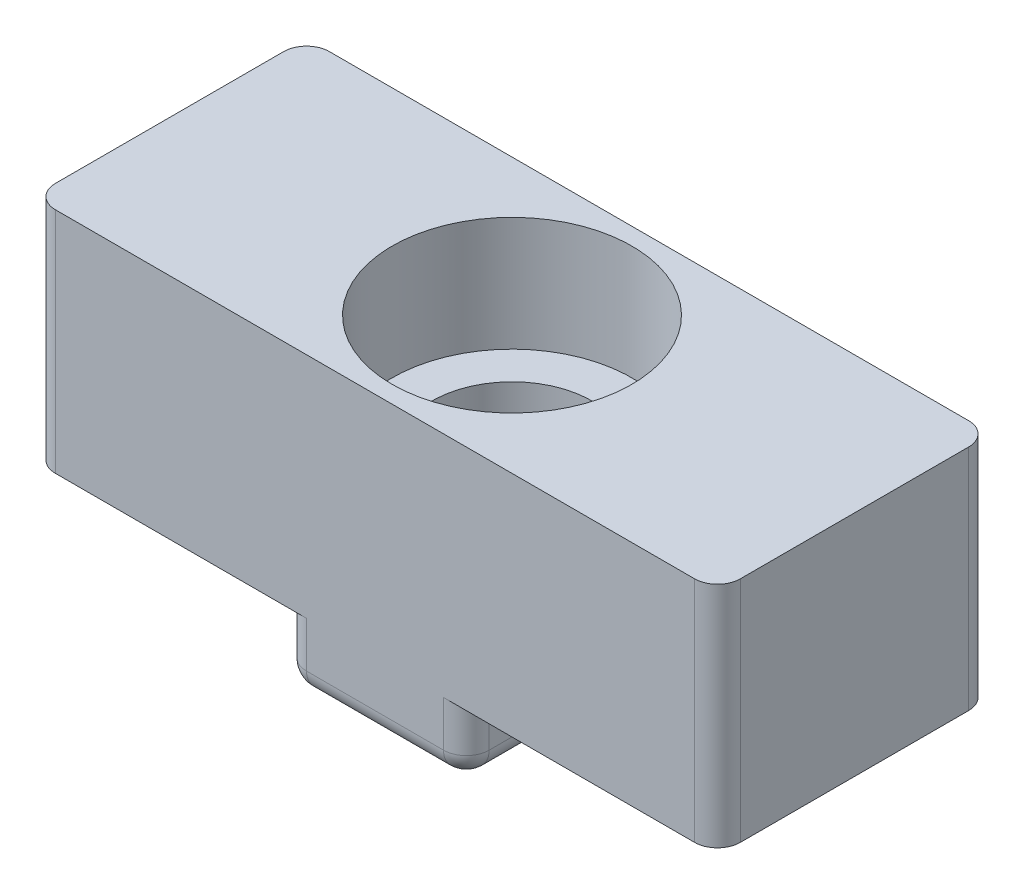
ISO-10303-21;
HEADER;
FILE_DESCRIPTION(('STEP AP214'),'2;1');
FILE_NAME('part.step','',(''),(''),'','','');
FILE_SCHEMA(('AUTOMOTIVE_DESIGN { 1 0 10303 214 1 1 1 1 }'));
ENDSEC;
DATA;
#1=APPLICATION_CONTEXT('core data for automotive mechanical design processes');
#2=APPLICATION_PROTOCOL_DEFINITION('international standard','automotive_design',2000,#1);
#3=PRODUCT_CONTEXT('',#1,'mechanical');
#4=PRODUCT('Part','Part','',(#3));
#5=PRODUCT_RELATED_PRODUCT_CATEGORY('part','',(#4));
#6=PRODUCT_DEFINITION_FORMATION('','',#4);
#7=PRODUCT_DEFINITION_CONTEXT('part definition',#1,'design');
#8=PRODUCT_DEFINITION('design','',#6,#7);
#9=PRODUCT_DEFINITION_SHAPE('','',#8);
#10=(LENGTH_UNIT() NAMED_UNIT(*) SI_UNIT(.MILLI.,.METRE.));
#11=(NAMED_UNIT(*) PLANE_ANGLE_UNIT() SI_UNIT($,.RADIAN.));
#12=(NAMED_UNIT(*) SI_UNIT($,.STERADIAN.) SOLID_ANGLE_UNIT());
#13=UNCERTAINTY_MEASURE_WITH_UNIT(LENGTH_MEASURE(1.E-05),#10,'distance_accuracy_value','');
#14=(GEOMETRIC_REPRESENTATION_CONTEXT(3) GLOBAL_UNCERTAINTY_ASSIGNED_CONTEXT((#13)) GLOBAL_UNIT_ASSIGNED_CONTEXT((#10,
#11,#12)) REPRESENTATION_CONTEXT('',''));
#15=CARTESIAN_POINT('',(0.,0.,0.));
#16=DIRECTION('',(0.,0.,1.));
#17=DIRECTION('',(1.,0.,0.));
#18=AXIS2_PLACEMENT_3D('',#15,#16,#17);
#19=CARTESIAN_POINT('',(-4.,0.,6.));
#20=DIRECTION('',(0.,1.,0.));
#21=DIRECTION('',(0.,0.,1.));
#22=AXIS2_PLACEMENT_3D('',#19,#20,#21);
#23=PLANE('',#22);
#24=CARTESIAN_POINT('',(0.,0.,0.));
#25=DIRECTION('',(0.,1.,0.));
#26=DIRECTION('',(0.,0.,1.));
#27=AXIS2_PLACEMENT_3D('',#24,#25,#26);
#28=CIRCLE('',#27,3.5);
#29=CARTESIAN_POINT('',(-3.,0.,1.80277563773199));
#30=VERTEX_POINT('',#29);
#31=CARTESIAN_POINT('',(3.,0.,1.80277563773199));
#32=VERTEX_POINT('',#31);
#33=EDGE_CURVE('E179',#30,#32,#28,.T.);
#34=ORIENTED_EDGE('',*,*,#33,.T.);
#35=DIRECTION('',(0.,0.,-1.));
#36=VECTOR('',#35,1.);
#37=CARTESIAN_POINT('',(3.,0.,6.));
#38=LINE('',#37,#36);
#39=CARTESIAN_POINT('',(3.,0.,5.));
#40=VERTEX_POINT('',#39);
#41=EDGE_CURVE('E190',#32,#40,#38,.F.);
#42=ORIENTED_EDGE('',*,*,#41,.T.);
#43=DIRECTION('',(1.,0.,0.));
#44=VECTOR('',#43,1.);
#45=CARTESIAN_POINT('',(-4.,0.,5.));
#46=LINE('',#45,#44);
#47=CARTESIAN_POINT('',(-3.,0.,5.));
#48=VERTEX_POINT('',#47);
#49=EDGE_CURVE('E202',#40,#48,#46,.F.);
#50=ORIENTED_EDGE('',*,*,#49,.T.);
#51=DIRECTION('',(0.,0.,-1.));
#52=VECTOR('',#51,1.);
#53=CARTESIAN_POINT('',(-3.,0.,6.));
#54=LINE('',#53,#52);
#55=EDGE_CURVE('E193',#48,#30,#54,.T.);
#56=ORIENTED_EDGE('',*,*,#55,.T.);
#57=EDGE_LOOP('',(#34,#42,#50,#56));
#58=FACE_BOUND('',#57,.T.);
#59=ADVANCED_FACE('F33',(#58),#23,.F.);
#60=CARTESIAN_POINT('',(15.,13.,6.));
#61=DIRECTION('',(0.,-1.,0.));
#62=DIRECTION('',(0.,0.,-1.));
#63=AXIS2_PLACEMENT_3D('',#60,#61,#62);
#64=PLANE('',#63);
#65=CARTESIAN_POINT('',(0.,13.,0.));
#66=DIRECTION('',(0.,1.,0.));
#67=DIRECTION('',(0.,0.,1.));
#68=AXIS2_PLACEMENT_3D('',#65,#66,#67);
#69=CIRCLE('',#68,5.25);
#70=CARTESIAN_POINT('',(0.,13.,5.25));
#71=VERTEX_POINT('',#70);
#72=EDGE_CURVE('E561',#71,#71,#69,.T.);
#73=ORIENTED_EDGE('',*,*,#72,.F.);
#74=EDGE_LOOP('',(#73));
#75=FACE_BOUND('',#74,.T.);
#76=DIRECTION('',(0.,0.,-1.));
#77=VECTOR('',#76,1.);
#78=CARTESIAN_POINT('',(15.,13.,6.));
#79=LINE('',#78,#77);
#80=CARTESIAN_POINT('',(15.,13.,5.));
#81=VERTEX_POINT('',#80);
#82=CARTESIAN_POINT('',(15.,13.,-5.));
#83=VERTEX_POINT('',#82);
#84=EDGE_CURVE('E582',#81,#83,#79,.T.);
#85=ORIENTED_EDGE('',*,*,#84,.T.);
#86=CARTESIAN_POINT('',(14.,13.,-5.));
#87=DIRECTION('',(0.,-1.,0.));
#88=DIRECTION('',(0.,0.,-1.));
#89=AXIS2_PLACEMENT_3D('',#86,#87,#88);
#90=CIRCLE('',#89,1.);
#91=CARTESIAN_POINT('',(14.,13.,-6.));
#92=VERTEX_POINT('',#91);
#93=EDGE_CURVE('E514',#83,#92,#90,.F.);
#94=ORIENTED_EDGE('',*,*,#93,.T.);
#95=DIRECTION('',(-1.,0.,0.));
#96=VECTOR('',#95,1.);
#97=CARTESIAN_POINT('',(15.,13.,-6.));
#98=LINE('',#97,#96);
#99=CARTESIAN_POINT('',(-14.,13.,-6.));
#100=VERTEX_POINT('',#99);
#101=EDGE_CURVE('E583',#92,#100,#98,.T.);
#102=ORIENTED_EDGE('',*,*,#101,.T.);
#103=CARTESIAN_POINT('',(-14.,13.,-5.));
#104=DIRECTION('',(0.,-1.,0.));
#105=DIRECTION('',(0.,0.,-1.));
#106=AXIS2_PLACEMENT_3D('',#103,#104,#105);
#107=CIRCLE('',#106,1.);
#108=CARTESIAN_POINT('',(-15.,13.,-5.));
#109=VERTEX_POINT('',#108);
#110=EDGE_CURVE('E497',#100,#109,#107,.F.);
#111=ORIENTED_EDGE('',*,*,#110,.T.);
#112=DIRECTION('',(0.,0.,-1.));
#113=VECTOR('',#112,1.);
#114=CARTESIAN_POINT('',(-15.,13.,6.));
#115=LINE('',#114,#113);
#116=CARTESIAN_POINT('',(-15.,13.,5.));
#117=VERTEX_POINT('',#116);
#118=EDGE_CURVE('E602',#117,#109,#115,.T.);
#119=ORIENTED_EDGE('',*,*,#118,.F.);
#120=CARTESIAN_POINT('',(-14.,13.,5.));
#121=DIRECTION('',(0.,-1.,0.));
#122=DIRECTION('',(0.,0.,-1.));
#123=AXIS2_PLACEMENT_3D('',#120,#121,#122);
#124=CIRCLE('',#123,1.);
#125=CARTESIAN_POINT('',(-14.,13.,6.));
#126=VERTEX_POINT('',#125);
#127=EDGE_CURVE('E503',#117,#126,#124,.F.);
#128=ORIENTED_EDGE('',*,*,#127,.T.);
#129=DIRECTION('',(-1.,0.,0.));
#130=VECTOR('',#129,1.);
#131=CARTESIAN_POINT('',(15.,13.,6.));
#132=LINE('',#131,#130);
#133=CARTESIAN_POINT('',(14.,13.,6.));
#134=VERTEX_POINT('',#133);
#135=EDGE_CURVE('E573',#134,#126,#132,.T.);
#136=ORIENTED_EDGE('',*,*,#135,.F.);
#137=CARTESIAN_POINT('',(14.,13.,5.));
#138=DIRECTION('',(0.,-1.,0.));
#139=DIRECTION('',(0.,0.,-1.));
#140=AXIS2_PLACEMENT_3D('',#137,#138,#139);
#141=CIRCLE('',#140,1.);
#142=EDGE_CURVE('E506',#134,#81,#141,.F.);
#143=ORIENTED_EDGE('',*,*,#142,.T.);
#144=EDGE_LOOP('',(#85,#94,#102,#111,#119,#128,#136,#143));
#145=FACE_BOUND('',#144,.T.);
#146=ADVANCED_FACE('F291',(#75,#145),#64,.F.);
#147=CARTESIAN_POINT('',(-15.,13.,6.));
#148=DIRECTION('',(1.,0.,0.));
#149=DIRECTION('',(0.,0.,-1.));
#150=AXIS2_PLACEMENT_3D('',#147,#148,#149);
#151=PLANE('',#150);
#152=DIRECTION('',(0.,0.,-1.));
#153=VECTOR('',#152,1.);
#154=CARTESIAN_POINT('',(-15.,3.,6.));
#155=LINE('',#154,#153);
#156=CARTESIAN_POINT('',(-15.,3.,5.));
#157=VERTEX_POINT('',#156);
#158=CARTESIAN_POINT('',(-15.,3.,-5.));
#159=VERTEX_POINT('',#158);
#160=EDGE_CURVE('E600',#157,#159,#155,.T.);
#161=ORIENTED_EDGE('',*,*,#160,.F.);
#162=DIRECTION('',(0.,-1.,0.));
#163=VECTOR('',#162,1.);
#164=CARTESIAN_POINT('',(-15.,13.,5.));
#165=LINE('',#164,#163);
#166=EDGE_CURVE('E523',#157,#117,#165,.F.);
#167=ORIENTED_EDGE('',*,*,#166,.T.);
#168=ORIENTED_EDGE('',*,*,#118,.T.);
#169=DIRECTION('',(0.,-1.,0.));
#170=VECTOR('',#169,1.);
#171=CARTESIAN_POINT('',(-15.,13.,-5.));
#172=LINE('',#171,#170);
#173=EDGE_CURVE('E498',#109,#159,#172,.T.);
#174=ORIENTED_EDGE('',*,*,#173,.T.);
#175=EDGE_LOOP('',(#161,#167,#168,#174));
#176=FACE_BOUND('',#175,.T.);
#177=ADVANCED_FACE('F288',(#176),#151,.F.);
#178=CARTESIAN_POINT('',(-15.,3.,6.));
#179=DIRECTION('',(0.,1.,0.));
#180=DIRECTION('',(-1.,0.,0.));
#181=AXIS2_PLACEMENT_3D('',#178,#179,#180);
#182=PLANE('',#181);
#183=DIRECTION('',(1.,0.,0.));
#184=VECTOR('',#183,1.);
#185=CARTESIAN_POINT('',(-15.,3.,6.));
#186=LINE('',#185,#184);
#187=CARTESIAN_POINT('',(-14.,3.,6.));
#188=VERTEX_POINT('',#187);
#189=CARTESIAN_POINT('',(-3.,3.,6.));
#190=VERTEX_POINT('',#189);
#191=EDGE_CURVE('E576',#188,#190,#186,.T.);
#192=ORIENTED_EDGE('',*,*,#191,.F.);
#193=CARTESIAN_POINT('',(-14.,3.,5.));
#194=DIRECTION('',(0.,1.,0.));
#195=DIRECTION('',(-1.,0.,0.));
#196=AXIS2_PLACEMENT_3D('',#193,#194,#195);
#197=CIRCLE('',#196,1.);
#198=EDGE_CURVE('E58',#188,#157,#197,.F.);
#199=ORIENTED_EDGE('',*,*,#198,.T.);
#200=ORIENTED_EDGE('',*,*,#160,.T.);
#201=CARTESIAN_POINT('',(-14.,3.,-5.));
#202=DIRECTION('',(0.,1.,0.));
#203=DIRECTION('',(-1.,0.,0.));
#204=AXIS2_PLACEMENT_3D('',#201,#202,#203);
#205=CIRCLE('',#204,1.);
#206=CARTESIAN_POINT('',(-14.,3.,-6.));
#207=VERTEX_POINT('',#206);
#208=EDGE_CURVE('E50',#159,#207,#205,.F.);
#209=ORIENTED_EDGE('',*,*,#208,.T.);
#210=DIRECTION('',(1.,0.,0.));
#211=VECTOR('',#210,1.);
#212=CARTESIAN_POINT('',(-15.,3.,-6.));
#213=LINE('',#212,#211);
#214=CARTESIAN_POINT('',(-3.,3.,-6.));
#215=VERTEX_POINT('',#214);
#216=EDGE_CURVE('E585',#207,#215,#213,.T.);
#217=ORIENTED_EDGE('',*,*,#216,.T.);
#218=CARTESIAN_POINT('',(-3.,3.,-5.));
#219=DIRECTION('',(0.,1.,0.));
#220=DIRECTION('',(-1.,0.,0.));
#221=AXIS2_PLACEMENT_3D('',#218,#219,#220);
#222=CIRCLE('',#221,1.);
#223=CARTESIAN_POINT('',(-4.,3.,-5.));
#224=VERTEX_POINT('',#223);
#225=EDGE_CURVE('E525',#215,#224,#222,.T.);
#226=ORIENTED_EDGE('',*,*,#225,.T.);
#227=DIRECTION('',(0.,0.,-1.));
#228=VECTOR('',#227,1.);
#229=CARTESIAN_POINT('',(-4.,3.,6.));
#230=LINE('',#229,#228);
#231=CARTESIAN_POINT('',(-4.,3.,5.));
#232=VERTEX_POINT('',#231);
#233=EDGE_CURVE('E597',#232,#224,#230,.T.);
#234=ORIENTED_EDGE('',*,*,#233,.F.);
#235=CARTESIAN_POINT('',(-3.,3.,5.));
#236=DIRECTION('',(0.,1.,0.));
#237=DIRECTION('',(-1.,0.,0.));
#238=AXIS2_PLACEMENT_3D('',#235,#236,#237);
#239=CIRCLE('',#238,1.);
#240=EDGE_CURVE('E11',#232,#190,#239,.T.);
#241=ORIENTED_EDGE('',*,*,#240,.T.);
#242=EDGE_LOOP('',(#192,#199,#200,#209,#217,#226,#234,#241));
#243=FACE_BOUND('',#242,.T.);
#244=ADVANCED_FACE('F284',(#243),#182,.F.);
#245=CARTESIAN_POINT('',(-4.,3.,6.));
#246=DIRECTION('',(1.,0.,0.));
#247=DIRECTION('',(0.,0.,-1.));
#248=AXIS2_PLACEMENT_3D('',#245,#246,#247);
#249=PLANE('',#248);
#250=ORIENTED_EDGE('',*,*,#233,.T.);
#251=DIRECTION('',(0.,-1.,0.));
#252=VECTOR('',#251,1.);
#253=CARTESIAN_POINT('',(-4.,3.,-5.));
#254=LINE('',#253,#252);
#255=CARTESIAN_POINT('',(-4.,1.,-5.));
#256=VERTEX_POINT('',#255);
#257=EDGE_CURVE('E638',#224,#256,#254,.T.);
#258=ORIENTED_EDGE('',*,*,#257,.T.);
#259=DIRECTION('',(0.,0.,-1.));
#260=VECTOR('',#259,1.);
#261=CARTESIAN_POINT('',(-4.,1.,6.));
#262=LINE('',#261,#260);
#263=CARTESIAN_POINT('',(-4.,1.,5.));
#264=VERTEX_POINT('',#263);
#265=EDGE_CURVE('E635',#256,#264,#262,.F.);
#266=ORIENTED_EDGE('',*,*,#265,.T.);
#267=DIRECTION('',(0.,-1.,0.));
#268=VECTOR('',#267,1.);
#269=CARTESIAN_POINT('',(-4.,3.,5.));
#270=LINE('',#269,#268);
#271=EDGE_CURVE('E186',#264,#232,#270,.F.);
#272=ORIENTED_EDGE('',*,*,#271,.T.);
#273=EDGE_LOOP('',(#250,#258,#266,#272));
#274=FACE_BOUND('',#273,.T.);
#275=ADVANCED_FACE('F280',(#274),#249,.F.);
#276=DIRECTION('',(1.,0.,0.));
#277=VECTOR('',#276,1.);
#278=CARTESIAN_POINT('',(-4.,0.,-5.));
#279=LINE('',#278,#277);
#280=CARTESIAN_POINT('',(-3.,0.,-5.));
#281=VERTEX_POINT('',#280);
#282=CARTESIAN_POINT('',(3.,0.,-5.));
#283=VERTEX_POINT('',#282);
#284=EDGE_CURVE('E606',#281,#283,#279,.T.);
#285=ORIENTED_EDGE('',*,*,#284,.T.);
#286=DIRECTION('',(0.,0.,-1.));
#287=VECTOR('',#286,1.);
#288=CARTESIAN_POINT('',(3.,0.,6.));
#289=LINE('',#288,#287);
#290=CARTESIAN_POINT('',(3.,0.,-1.80277563773199));
#291=VERTEX_POINT('',#290);
#292=EDGE_CURVE('E609',#283,#291,#289,.F.);
#293=ORIENTED_EDGE('',*,*,#292,.T.);
#294=CARTESIAN_POINT('',(-3.,0.,-1.80277563773199));
#295=VERTEX_POINT('',#294);
#296=EDGE_CURVE('E182',#291,#295,#28,.T.);
#297=ORIENTED_EDGE('',*,*,#296,.T.);
#298=DIRECTION('',(0.,0.,-1.));
#299=VECTOR('',#298,1.);
#300=CARTESIAN_POINT('',(-3.,0.,6.));
#301=LINE('',#300,#299);
#302=EDGE_CURVE('E604',#295,#281,#301,.T.);
#303=ORIENTED_EDGE('',*,*,#302,.T.);
#304=EDGE_LOOP('',(#285,#293,#297,#303));
#305=FACE_BOUND('',#304,.T.);
#306=ADVANCED_FACE('F276',(#305),#23,.F.);
#307=CARTESIAN_POINT('',(4.,0.,6.));
#308=DIRECTION('',(-1.,0.,0.));
#309=DIRECTION('',(0.,0.,1.));
#310=AXIS2_PLACEMENT_3D('',#307,#308,#309);
#311=PLANE('',#310);
#312=DIRECTION('',(0.,0.,-1.));
#313=VECTOR('',#312,1.);
#314=CARTESIAN_POINT('',(4.,3.,6.));
#315=LINE('',#314,#313);
#316=CARTESIAN_POINT('',(4.,3.,5.));
#317=VERTEX_POINT('',#316);
#318=CARTESIAN_POINT('',(4.,3.,-5.));
#319=VERTEX_POINT('',#318);
#320=EDGE_CURVE('E594',#317,#319,#315,.T.);
#321=ORIENTED_EDGE('',*,*,#320,.F.);
#322=DIRECTION('',(0.,1.,0.));
#323=VECTOR('',#322,1.);
#324=CARTESIAN_POINT('',(4.,0.,5.));
#325=LINE('',#324,#323);
#326=CARTESIAN_POINT('',(4.,1.,5.));
#327=VERTEX_POINT('',#326);
#328=EDGE_CURVE('E235',#317,#327,#325,.F.);
#329=ORIENTED_EDGE('',*,*,#328,.T.);
#330=DIRECTION('',(0.,0.,-1.));
#331=VECTOR('',#330,1.);
#332=CARTESIAN_POINT('',(4.,1.,6.));
#333=LINE('',#332,#331);
#334=CARTESIAN_POINT('',(4.,1.,-5.));
#335=VERTEX_POINT('',#334);
#336=EDGE_CURVE('E233',#327,#335,#333,.T.);
#337=ORIENTED_EDGE('',*,*,#336,.T.);
#338=DIRECTION('',(0.,1.,0.));
#339=VECTOR('',#338,1.);
#340=CARTESIAN_POINT('',(4.,0.,-5.));
#341=LINE('',#340,#339);
#342=EDGE_CURVE('E231',#335,#319,#341,.T.);
#343=ORIENTED_EDGE('',*,*,#342,.T.);
#344=EDGE_LOOP('',(#321,#329,#337,#343));
#345=FACE_BOUND('',#344,.T.);
#346=ADVANCED_FACE('F272',(#345),#311,.F.);
#347=CARTESIAN_POINT('',(4.,3.,6.));
#348=DIRECTION('',(0.,1.,0.));
#349=DIRECTION('',(-1.,0.,0.));
#350=AXIS2_PLACEMENT_3D('',#347,#348,#349);
#351=PLANE('',#350);
#352=DIRECTION('',(1.,0.,0.));
#353=VECTOR('',#352,1.);
#354=CARTESIAN_POINT('',(4.,3.,-6.));
#355=LINE('',#354,#353);
#356=CARTESIAN_POINT('',(3.,3.,-6.));
#357=VERTEX_POINT('',#356);
#358=CARTESIAN_POINT('',(14.,3.,-6.));
#359=VERTEX_POINT('',#358);
#360=EDGE_CURVE('E577',#357,#359,#355,.T.);
#361=ORIENTED_EDGE('',*,*,#360,.T.);
#362=CARTESIAN_POINT('',(14.,3.,-5.));
#363=DIRECTION('',(0.,1.,0.));
#364=DIRECTION('',(-1.,0.,0.));
#365=AXIS2_PLACEMENT_3D('',#362,#363,#364);
#366=CIRCLE('',#365,1.);
#367=CARTESIAN_POINT('',(15.,3.,-5.));
#368=VERTEX_POINT('',#367);
#369=EDGE_CURVE('E518',#359,#368,#366,.F.);
#370=ORIENTED_EDGE('',*,*,#369,.T.);
#371=DIRECTION('',(0.,0.,-1.));
#372=VECTOR('',#371,1.);
#373=CARTESIAN_POINT('',(15.,3.,6.));
#374=LINE('',#373,#372);
#375=CARTESIAN_POINT('',(15.,3.,5.));
#376=VERTEX_POINT('',#375);
#377=EDGE_CURVE('E591',#376,#368,#374,.T.);
#378=ORIENTED_EDGE('',*,*,#377,.F.);
#379=CARTESIAN_POINT('',(14.,3.,5.));
#380=DIRECTION('',(0.,1.,0.));
#381=DIRECTION('',(-1.,0.,0.));
#382=AXIS2_PLACEMENT_3D('',#379,#380,#381);
#383=CIRCLE('',#382,1.);
#384=CARTESIAN_POINT('',(14.,3.,6.));
#385=VERTEX_POINT('',#384);
#386=EDGE_CURVE('E516',#376,#385,#383,.F.);
#387=ORIENTED_EDGE('',*,*,#386,.T.);
#388=DIRECTION('',(1.,0.,0.));
#389=VECTOR('',#388,1.);
#390=CARTESIAN_POINT('',(4.,3.,6.));
#391=LINE('',#390,#389);
#392=CARTESIAN_POINT('',(3.,3.,6.));
#393=VERTEX_POINT('',#392);
#394=EDGE_CURVE('E579',#393,#385,#391,.T.);
#395=ORIENTED_EDGE('',*,*,#394,.F.);
#396=CARTESIAN_POINT('',(3.,3.,5.));
#397=DIRECTION('',(0.,1.,0.));
#398=DIRECTION('',(-1.,0.,0.));
#399=AXIS2_PLACEMENT_3D('',#396,#397,#398);
#400=CIRCLE('',#399,1.);
#401=EDGE_CURVE('E527',#393,#317,#400,.T.);
#402=ORIENTED_EDGE('',*,*,#401,.T.);
#403=ORIENTED_EDGE('',*,*,#320,.T.);
#404=CARTESIAN_POINT('',(3.,3.,-5.));
#405=DIRECTION('',(0.,1.,0.));
#406=DIRECTION('',(-1.,0.,0.));
#407=AXIS2_PLACEMENT_3D('',#404,#405,#406);
#408=CIRCLE('',#407,1.);
#409=EDGE_CURVE('E42',#319,#357,#408,.T.);
#410=ORIENTED_EDGE('',*,*,#409,.T.);
#411=EDGE_LOOP('',(#361,#370,#378,#387,#395,#402,#403,#410));
#412=FACE_BOUND('',#411,.T.);
#413=ADVANCED_FACE('F268',(#412),#351,.F.);
#414=CARTESIAN_POINT('',(15.,3.,6.));
#415=DIRECTION('',(-1.,0.,0.));
#416=DIRECTION('',(0.,0.,1.));
#417=AXIS2_PLACEMENT_3D('',#414,#415,#416);
#418=PLANE('',#417);
#419=ORIENTED_EDGE('',*,*,#377,.T.);
#420=DIRECTION('',(0.,1.,0.));
#421=VECTOR('',#420,1.);
#422=CARTESIAN_POINT('',(15.,3.,-5.));
#423=LINE('',#422,#421);
#424=EDGE_CURVE('E504',#368,#83,#423,.T.);
#425=ORIENTED_EDGE('',*,*,#424,.T.);
#426=ORIENTED_EDGE('',*,*,#84,.F.);
#427=DIRECTION('',(0.,1.,0.));
#428=VECTOR('',#427,1.);
#429=CARTESIAN_POINT('',(15.,3.,5.));
#430=LINE('',#429,#428);
#431=EDGE_CURVE('E509',#81,#376,#430,.F.);
#432=ORIENTED_EDGE('',*,*,#431,.T.);
#433=EDGE_LOOP('',(#419,#425,#426,#432));
#434=FACE_BOUND('',#433,.T.);
#435=ADVANCED_FACE('F261',(#434),#418,.F.);
#436=CARTESIAN_POINT('',(0.,0.,6.));
#437=DIRECTION('',(0.,0.,1.));
#438=DIRECTION('',(1.,0.,0.));
#439=AXIS2_PLACEMENT_3D('',#436,#437,#438);
#440=PLANE('',#439);
#441=DIRECTION('',(0.,1.,0.));
#442=VECTOR('',#441,1.);
#443=CARTESIAN_POINT('',(3.,3.,6.));
#444=LINE('',#443,#442);
#445=CARTESIAN_POINT('',(3.,1.,6.));
#446=VERTEX_POINT('',#445);
#447=EDGE_CURVE('E228',#446,#393,#444,.T.);
#448=ORIENTED_EDGE('',*,*,#447,.T.);
#449=ORIENTED_EDGE('',*,*,#394,.T.);
#450=DIRECTION('',(0.,1.,0.));
#451=VECTOR('',#450,1.);
#452=CARTESIAN_POINT('',(14.,13.,6.));
#453=LINE('',#452,#451);
#454=EDGE_CURVE('E221',#385,#134,#453,.T.);
#455=ORIENTED_EDGE('',*,*,#454,.T.);
#456=ORIENTED_EDGE('',*,*,#135,.T.);
#457=DIRECTION('',(0.,-1.,0.));
#458=VECTOR('',#457,1.);
#459=CARTESIAN_POINT('',(-14.,3.,6.));
#460=LINE('',#459,#458);
#461=EDGE_CURVE('E218',#126,#188,#460,.T.);
#462=ORIENTED_EDGE('',*,*,#461,.T.);
#463=ORIENTED_EDGE('',*,*,#191,.T.);
#464=DIRECTION('',(0.,-1.,0.));
#465=VECTOR('',#464,1.);
#466=CARTESIAN_POINT('',(-3.,0.,6.));
#467=LINE('',#466,#465);
#468=CARTESIAN_POINT('',(-3.,1.,6.));
#469=VERTEX_POINT('',#468);
#470=EDGE_CURVE('E224',#190,#469,#467,.T.);
#471=ORIENTED_EDGE('',*,*,#470,.T.);
#472=DIRECTION('',(1.,0.,0.));
#473=VECTOR('',#472,1.);
#474=CARTESIAN_POINT('',(4.,1.,6.));
#475=LINE('',#474,#473);
#476=EDGE_CURVE('E226',#469,#446,#475,.T.);
#477=ORIENTED_EDGE('',*,*,#476,.T.);
#478=EDGE_LOOP('',(#448,#449,#455,#456,#462,#463,#471,#477));
#479=FACE_BOUND('',#478,.T.);
#480=ADVANCED_FACE('F257',(#479),#440,.T.);
#481=CARTESIAN_POINT('',(0.,0.,-6.));
#482=DIRECTION('',(0.,0.,1.));
#483=DIRECTION('',(1.,0.,0.));
#484=AXIS2_PLACEMENT_3D('',#481,#482,#483);
#485=PLANE('',#484);
#486=DIRECTION('',(0.,-1.,0.));
#487=VECTOR('',#486,1.);
#488=CARTESIAN_POINT('',(-3.,0.,-6.));
#489=LINE('',#488,#487);
#490=CARTESIAN_POINT('',(-3.,1.,-6.));
#491=VERTEX_POINT('',#490);
#492=EDGE_CURVE('E215',#491,#215,#489,.F.);
#493=ORIENTED_EDGE('',*,*,#492,.T.);
#494=ORIENTED_EDGE('',*,*,#216,.F.);
#495=DIRECTION('',(0.,-1.,0.));
#496=VECTOR('',#495,1.);
#497=CARTESIAN_POINT('',(-14.,0.,-6.));
#498=LINE('',#497,#496);
#499=EDGE_CURVE('E201',#207,#100,#498,.F.);
#500=ORIENTED_EDGE('',*,*,#499,.T.);
#501=ORIENTED_EDGE('',*,*,#101,.F.);
#502=DIRECTION('',(0.,1.,0.));
#503=VECTOR('',#502,1.);
#504=CARTESIAN_POINT('',(14.,0.,-6.));
#505=LINE('',#504,#503);
#506=EDGE_CURVE('E204',#92,#359,#505,.F.);
#507=ORIENTED_EDGE('',*,*,#506,.T.);
#508=ORIENTED_EDGE('',*,*,#360,.F.);
#509=DIRECTION('',(0.,1.,0.));
#510=VECTOR('',#509,1.);
#511=CARTESIAN_POINT('',(3.,0.,-6.));
#512=LINE('',#511,#510);
#513=CARTESIAN_POINT('',(3.,1.,-6.));
#514=VERTEX_POINT('',#513);
#515=EDGE_CURVE('E210',#357,#514,#512,.F.);
#516=ORIENTED_EDGE('',*,*,#515,.T.);
#517=DIRECTION('',(1.,0.,0.));
#518=VECTOR('',#517,1.);
#519=CARTESIAN_POINT('',(0.,1.,-6.));
#520=LINE('',#519,#518);
#521=EDGE_CURVE('E212',#514,#491,#520,.F.);
#522=ORIENTED_EDGE('',*,*,#521,.T.);
#523=EDGE_LOOP('',(#493,#494,#500,#501,#507,#508,#516,#522));
#524=FACE_BOUND('',#523,.T.);
#525=ADVANCED_FACE('F255',(#524),#485,.F.);
#526=CARTESIAN_POINT('',(0.,13.,0.));
#527=DIRECTION('',(0.,1.,0.));
#528=DIRECTION('',(0.,0.,1.));
#529=AXIS2_PLACEMENT_3D('',#526,#527,#528);
#530=CYLINDRICAL_SURFACE('',#529,3.5);
#531=ORIENTED_EDGE('',*,*,#296,.F.);
#532=CARTESIAN_POINT('',(3.,0.,-1.80277563773199));
#533=CARTESIAN_POINT('',(3.04282042081287,4.05951234378067E-05,-1.7315309723849));
#534=CARTESIAN_POINT('',(3.08304541766313,0.00274598049350696,-1.65883183931037));
#535=CARTESIAN_POINT('',(3.15810321141302,0.0118454243798903,-1.51103627148598));
#536=CARTESIAN_POINT('',(3.19294333450536,0.018234414275621,-1.43594326455653));
#537=CARTESIAN_POINT('',(3.25729632218495,0.0331034224374194,-1.28332291947223));
#538=CARTESIAN_POINT('',(3.2867839003349,0.0415929400136458,-1.20578595883621));
#539=CARTESIAN_POINT('',(3.34017781139382,0.0592180189432898,-1.04884892772401));
#540=CARTESIAN_POINT('',(3.36408162750432,0.0683538692138189,-0.969448034784069));
#541=CARTESIAN_POINT('',(3.4083176204823,0.0868142082052589,-0.801053867034685));
#542=CARTESIAN_POINT('',(3.42805400005452,0.0960662816677158,-0.711895058380694));
#543=CARTESIAN_POINT('',(3.46052197562137,0.112165671160978,-0.53209892401144));
#544=CARTESIAN_POINT('',(3.47325461560312,0.119013345539773,-0.441461820727861));
#545=CARTESIAN_POINT('',(3.49155505078771,0.129089883719479,-0.259556308818076));
#546=CARTESIAN_POINT('',(3.49714624951974,0.132330563646498,-0.168290952880193));
#547=CARTESIAN_POINT('',(3.50116299909107,0.134643572713676,0.0144479779220866));
#548=CARTESIAN_POINT('',(3.49958901093452,0.133716170026012,0.105921539012194));
#549=CARTESIAN_POINT('',(3.48937532073075,0.127908262985009,0.286989789541709));
#550=CARTESIAN_POINT('',(3.48083962043749,0.123085955252604,0.37659235508553));
#551=CARTESIAN_POINT('',(3.45693756565887,0.110399410923064,0.554669003296419));
#552=CARTESIAN_POINT('',(3.44156978840236,0.102534540760571,0.643142846958747));
#553=CARTESIAN_POINT('',(3.40410100686189,0.0850524538621369,0.818633945344217));
#554=CARTESIAN_POINT('',(3.38198813252216,0.0754321600120066,0.905648344621984));
#555=CARTESIAN_POINT('',(3.33115573130874,0.0560320950073529,1.07770726253582));
#556=CARTESIAN_POINT('',(3.30243547213633,0.0462523062876668,1.16275156167421));
#557=CARTESIAN_POINT('',(3.2337474653456,0.0269543891561946,1.34293909496165));
#558=CARTESIAN_POINT('',(3.19274574931776,0.0176874107885596,1.43772270752275));
#559=CARTESIAN_POINT('',(3.12502812483375,0.00758573529076599,1.57697675338798));
#560=CARTESIAN_POINT('',(3.10145284426054,0.0048526885893161,1.62285273098284));
#561=CARTESIAN_POINT('',(3.05225105441084,0.00106228103195137,1.71360172410193));
#562=CARTESIAN_POINT('',(3.02662309785395,6.11361507099094E-06,1.75847400291877));
#563=CARTESIAN_POINT('',(3.,0.,1.80277563773199));
#564=B_SPLINE_CURVE_WITH_KNOTS('',3,(#532,#533,#534,#535,#536,#537,#538,#539,#540,#541,#542,
#543,#544,#545,#546,#547,#548,#549,#550,#551,#552,#553,#554,#555,#556,#557,#558,#559,#560,#561,
#562,#563),.UNSPECIFIED.,.F.,.F.,(4,2,2,2,2,2,2,2,2,2,2,2,2,2,2,4),(0.,0.249147999335524,
0.4979539877399,0.747906414524428,0.997971287223849,1.27303052638857,1.54804875372408,
1.82216337471817,2.09626035957852,2.36633599500094,2.63646789968819,2.90707795360594,
3.17771801378923,3.48825886857255,3.64314524558774,3.79814180627765),.UNSPECIFIED.);
#565=EDGE_CURVE('E175',#291,#32,#564,.T.);
#566=ORIENTED_EDGE('',*,*,#565,.T.);
#567=ORIENTED_EDGE('',*,*,#33,.F.);
#568=CARTESIAN_POINT('',(-3.,0.,1.80277563773199));
#569=CARTESIAN_POINT('',(-3.04282042081287,4.05951234378067E-05,1.7315309723849));
#570=CARTESIAN_POINT('',(-3.08304541766313,0.00274598049350696,1.65883183931037));
#571=CARTESIAN_POINT('',(-3.15810321141302,0.0118454243798903,1.51103627148598));
#572=CARTESIAN_POINT('',(-3.19294333450536,0.018234414275621,1.43594326455653));
#573=CARTESIAN_POINT('',(-3.25729632218495,0.0331034224374194,1.28332291947223));
#574=CARTESIAN_POINT('',(-3.2867839003349,0.0415929400136458,1.20578595883621));
#575=CARTESIAN_POINT('',(-3.34017781139382,0.0592180189432898,1.04884892772401));
#576=CARTESIAN_POINT('',(-3.36408162750432,0.0683538692138189,0.969448034784069));
#577=CARTESIAN_POINT('',(-3.4083176204823,0.0868142082052589,0.801053867034685));
#578=CARTESIAN_POINT('',(-3.42805400005452,0.0960662816677158,0.711895058380694));
#579=CARTESIAN_POINT('',(-3.46052197562137,0.112165671160978,0.53209892401144));
#580=CARTESIAN_POINT('',(-3.47325461560312,0.119013345539773,0.441461820727861));
#581=CARTESIAN_POINT('',(-3.49155505078771,0.129089883719479,0.259556308818076));
#582=CARTESIAN_POINT('',(-3.49714624951974,0.132330563646498,0.168290952880193));
#583=CARTESIAN_POINT('',(-3.50116299909107,0.134643572713676,-0.0144479779220866));
#584=CARTESIAN_POINT('',(-3.49958901093452,0.133716170026012,-0.105921539012194));
#585=CARTESIAN_POINT('',(-3.48937532073075,0.127908262985009,-0.286989789541709));
#586=CARTESIAN_POINT('',(-3.48083962043749,0.123085955252604,-0.37659235508553));
#587=CARTESIAN_POINT('',(-3.45693756565887,0.110399410923064,-0.554669003296419));
#588=CARTESIAN_POINT('',(-3.44156978840236,0.102534540760571,-0.643142846958747));
#589=CARTESIAN_POINT('',(-3.40410100686189,0.0850524538621369,-0.818633945344217));
#590=CARTESIAN_POINT('',(-3.38198813252216,0.0754321600120066,-0.905648344621984));
#591=CARTESIAN_POINT('',(-3.33115573130874,0.0560320950073529,-1.07770726253582));
#592=CARTESIAN_POINT('',(-3.30243547213633,0.0462523062876668,-1.16275156167421));
#593=CARTESIAN_POINT('',(-3.2337474653456,0.0269543891561946,-1.34293909496165));
#594=CARTESIAN_POINT('',(-3.19274574931776,0.0176874107885596,-1.43772270752275));
#595=CARTESIAN_POINT('',(-3.12502812483375,0.00758573529076599,-1.57697675338798));
#596=CARTESIAN_POINT('',(-3.10145284426054,0.0048526885893161,-1.62285273098284));
#597=CARTESIAN_POINT('',(-3.05225105441084,0.00106228103195137,-1.71360172410193));
#598=CARTESIAN_POINT('',(-3.02662309785395,6.11361507099094E-06,-1.75847400291877));
#599=CARTESIAN_POINT('',(-3.,0.,-1.80277563773199));
#600=B_SPLINE_CURVE_WITH_KNOTS('',3,(#568,#569,#570,#571,#572,#573,#574,#575,#576,#577,#578,
#579,#580,#581,#582,#583,#584,#585,#586,#587,#588,#589,#590,#591,#592,#593,#594,#595,#596,#597,
#598,#599),.UNSPECIFIED.,.F.,.F.,(4,2,2,2,2,2,2,2,2,2,2,2,2,2,2,4),(0.,0.249147999335524,
0.4979539877399,0.747906414524428,0.997971287223849,1.27303052638857,1.54804875372408,
1.82216337471817,2.09626035957852,2.36633599500094,2.63646789968819,2.90707795360594,
3.17771801378923,3.48825886857255,3.64314524558774,3.79814180627765),.UNSPECIFIED.);
#601=EDGE_CURVE('E187',#30,#295,#600,.T.);
#602=ORIENTED_EDGE('',*,*,#601,.T.);
#603=EDGE_LOOP('',(#531,#566,#567,#602));
#604=FACE_BOUND('',#603,.T.);
#605=CARTESIAN_POINT('',(0.,8.,0.));
#606=DIRECTION('',(0.,1.,0.));
#607=DIRECTION('',(0.,0.,1.));
#608=AXIS2_PLACEMENT_3D('',#605,#606,#607);
#609=CIRCLE('',#608,3.5);
#610=CARTESIAN_POINT('',(0.,8.,3.5));
#611=VERTEX_POINT('',#610);
#612=EDGE_CURVE('E194',#611,#611,#609,.T.);
#613=ORIENTED_EDGE('',*,*,#612,.T.);
#614=EDGE_LOOP('',(#613));
#615=FACE_BOUND('',#614,.T.);
#616=ADVANCED_FACE('F177',(#604,#615),#530,.F.);
#617=CARTESIAN_POINT('',(3.5,8.,0.));
#618=DIRECTION('',(0.,-1.,0.));
#619=DIRECTION('',(0.,0.,-1.));
#620=AXIS2_PLACEMENT_3D('',#617,#618,#619);
#621=PLANE('',#620);
#622=ORIENTED_EDGE('',*,*,#612,.F.);
#623=EDGE_LOOP('',(#622));
#624=FACE_BOUND('',#623,.T.);
#625=CARTESIAN_POINT('',(0.,8.,0.));
#626=DIRECTION('',(0.,1.,0.));
#627=DIRECTION('',(0.,0.,1.));
#628=AXIS2_PLACEMENT_3D('',#625,#626,#627);
#629=CIRCLE('',#628,5.25);
#630=CARTESIAN_POINT('',(0.,8.,5.25));
#631=VERTEX_POINT('',#630);
#632=EDGE_CURVE('E564',#631,#631,#629,.T.);
#633=ORIENTED_EDGE('',*,*,#632,.T.);
#634=EDGE_LOOP('',(#633));
#635=FACE_BOUND('',#634,.T.);
#636=ADVANCED_FACE('F254',(#624,#635),#621,.F.);
#637=CARTESIAN_POINT('',(0.,13.,0.));
#638=DIRECTION('',(0.,1.,0.));
#639=DIRECTION('',(0.,0.,1.));
#640=AXIS2_PLACEMENT_3D('',#637,#638,#639);
#641=CYLINDRICAL_SURFACE('',#640,5.25);
#642=ORIENTED_EDGE('',*,*,#632,.F.);
#643=EDGE_LOOP('',(#642));
#644=FACE_BOUND('',#643,.T.);
#645=ORIENTED_EDGE('',*,*,#72,.T.);
#646=EDGE_LOOP('',(#645));
#647=FACE_BOUND('',#646,.T.);
#648=ADVANCED_FACE('F374',(#644,#647),#641,.F.);
#649=CARTESIAN_POINT('',(-3.,0.,5.));
#650=DIRECTION('',(0.,1.,0.));
#651=DIRECTION('',(0.,0.,1.));
#652=AXIS2_PLACEMENT_3D('',#649,#650,#651);
#653=CYLINDRICAL_SURFACE('',#652,1.);
#654=ORIENTED_EDGE('',*,*,#240,.F.);
#655=ORIENTED_EDGE('',*,*,#271,.F.);
#656=CARTESIAN_POINT('',(-3.,1.,5.));
#657=DIRECTION('',(0.,-1.,0.));
#658=DIRECTION('',(0.,0.,-1.));
#659=AXIS2_PLACEMENT_3D('',#656,#657,#658);
#660=CIRCLE('',#659,1.);
#661=EDGE_CURVE('E37',#469,#264,#660,.T.);
#662=ORIENTED_EDGE('',*,*,#661,.F.);
#663=ORIENTED_EDGE('',*,*,#470,.F.);
#664=EDGE_LOOP('',(#654,#655,#662,#663));
#665=FACE_BOUND('',#664,.T.);
#666=ADVANCED_FACE('F380',(#665),#653,.T.);
#667=CARTESIAN_POINT('',(0.,1.,5.));
#668=DIRECTION('',(-1.,0.,0.));
#669=DIRECTION('',(0.,0.,1.));
#670=AXIS2_PLACEMENT_3D('',#667,#668,#669);
#671=CYLINDRICAL_SURFACE('',#670,1.);
#672=CARTESIAN_POINT('',(3.,1.,5.));
#673=DIRECTION('',(1.,0.,0.));
#674=DIRECTION('',(0.,0.,-1.));
#675=AXIS2_PLACEMENT_3D('',#672,#673,#674);
#676=CIRCLE('',#675,1.);
#677=EDGE_CURVE('E554',#446,#40,#676,.T.);
#678=ORIENTED_EDGE('',*,*,#677,.F.);
#679=ORIENTED_EDGE('',*,*,#476,.F.);
#680=CARTESIAN_POINT('',(-3.,1.,5.));
#681=DIRECTION('',(-1.,0.,0.));
#682=DIRECTION('',(0.,0.,1.));
#683=AXIS2_PLACEMENT_3D('',#680,#681,#682);
#684=CIRCLE('',#683,1.);
#685=EDGE_CURVE('E556',#48,#469,#684,.T.);
#686=ORIENTED_EDGE('',*,*,#685,.F.);
#687=ORIENTED_EDGE('',*,*,#49,.F.);
#688=EDGE_LOOP('',(#678,#679,#686,#687));
#689=FACE_BOUND('',#688,.T.);
#690=ADVANCED_FACE('F386',(#689),#671,.T.);
#691=CARTESIAN_POINT('',(3.,0.,5.));
#692=DIRECTION('',(0.,-1.,0.));
#693=DIRECTION('',(0.,0.,-1.));
#694=AXIS2_PLACEMENT_3D('',#691,#692,#693);
#695=CYLINDRICAL_SURFACE('',#694,1.);
#696=ORIENTED_EDGE('',*,*,#401,.F.);
#697=ORIENTED_EDGE('',*,*,#447,.F.);
#698=CARTESIAN_POINT('',(3.,1.,5.));
#699=DIRECTION('',(0.,-1.,0.));
#700=DIRECTION('',(0.,0.,-1.));
#701=AXIS2_PLACEMENT_3D('',#698,#699,#700);
#702=CIRCLE('',#701,1.);
#703=EDGE_CURVE('E551',#327,#446,#702,.T.);
#704=ORIENTED_EDGE('',*,*,#703,.F.);
#705=ORIENTED_EDGE('',*,*,#328,.F.);
#706=EDGE_LOOP('',(#696,#697,#704,#705));
#707=FACE_BOUND('',#706,.T.);
#708=ADVANCED_FACE('F394',(#707),#695,.T.);
#709=CARTESIAN_POINT('',(-3.,1.,5.));
#710=DIRECTION('',(0.,0.,1.));
#711=DIRECTION('',(1.,0.,0.));
#712=AXIS2_PLACEMENT_3D('',#709,#710,#711);
#713=SPHERICAL_SURFACE('',#712,1.);
#714=ORIENTED_EDGE('',*,*,#685,.T.);
#715=ORIENTED_EDGE('',*,*,#661,.T.);
#716=CARTESIAN_POINT('',(-3.,1.,5.));
#717=DIRECTION('',(0.,0.,1.));
#718=DIRECTION('',(1.,0.,0.));
#719=AXIS2_PLACEMENT_3D('',#716,#717,#718);
#720=CIRCLE('',#719,1.);
#721=EDGE_CURVE('E548',#48,#264,#720,.F.);
#722=ORIENTED_EDGE('',*,*,#721,.F.);
#723=EDGE_LOOP('',(#714,#715,#722));
#724=FACE_BOUND('',#723,.T.);
#725=ADVANCED_FACE('F402',(#724),#713,.T.);
#726=CARTESIAN_POINT('',(3.,1.,5.));
#727=DIRECTION('',(0.,0.,1.));
#728=DIRECTION('',(1.,0.,0.));
#729=AXIS2_PLACEMENT_3D('',#726,#727,#728);
#730=SPHERICAL_SURFACE('',#729,1.);
#731=ORIENTED_EDGE('',*,*,#703,.T.);
#732=ORIENTED_EDGE('',*,*,#677,.T.);
#733=CARTESIAN_POINT('',(3.,1.,5.));
#734=DIRECTION('',(0.,0.,1.));
#735=DIRECTION('',(1.,0.,0.));
#736=AXIS2_PLACEMENT_3D('',#733,#734,#735);
#737=CIRCLE('',#736,1.);
#738=EDGE_CURVE('E200',#327,#40,#737,.F.);
#739=ORIENTED_EDGE('',*,*,#738,.F.);
#740=EDGE_LOOP('',(#731,#732,#739));
#741=FACE_BOUND('',#740,.T.);
#742=ADVANCED_FACE('F410',(#741),#730,.T.);
#743=CARTESIAN_POINT('',(-3.,3.,-5.));
#744=DIRECTION('',(0.,-1.,0.));
#745=DIRECTION('',(0.,0.,-1.));
#746=AXIS2_PLACEMENT_3D('',#743,#744,#745);
#747=CYLINDRICAL_SURFACE('',#746,1.);
#748=ORIENTED_EDGE('',*,*,#225,.F.);
#749=ORIENTED_EDGE('',*,*,#492,.F.);
#750=CARTESIAN_POINT('',(-3.,1.,-5.));
#751=DIRECTION('',(0.,-1.,0.));
#752=DIRECTION('',(0.,0.,-1.));
#753=AXIS2_PLACEMENT_3D('',#750,#751,#752);
#754=CIRCLE('',#753,1.);
#755=EDGE_CURVE('E544',#256,#491,#754,.T.);
#756=ORIENTED_EDGE('',*,*,#755,.F.);
#757=ORIENTED_EDGE('',*,*,#257,.F.);
#758=EDGE_LOOP('',(#748,#749,#756,#757));
#759=FACE_BOUND('',#758,.T.);
#760=ADVANCED_FACE('F317',(#759),#747,.T.);
#761=CARTESIAN_POINT('',(-3.,1.,6.));
#762=DIRECTION('',(0.,0.,-1.));
#763=DIRECTION('',(-1.,0.,0.));
#764=AXIS2_PLACEMENT_3D('',#761,#762,#763);
#765=CYLINDRICAL_SURFACE('',#764,1.);
#766=ORIENTED_EDGE('',*,*,#721,.T.);
#767=ORIENTED_EDGE('',*,*,#265,.F.);
#768=CARTESIAN_POINT('',(-3.,1.,-5.));
#769=DIRECTION('',(0.,0.,-1.));
#770=DIRECTION('',(-1.,0.,0.));
#771=AXIS2_PLACEMENT_3D('',#768,#769,#770);
#772=CIRCLE('',#771,1.);
#773=EDGE_CURVE('E541',#281,#256,#772,.T.);
#774=ORIENTED_EDGE('',*,*,#773,.F.);
#775=ORIENTED_EDGE('',*,*,#302,.F.);
#776=ORIENTED_EDGE('',*,*,#601,.F.);
#777=ORIENTED_EDGE('',*,*,#55,.F.);
#778=EDGE_LOOP('',(#766,#767,#774,#775,#776,#777));
#779=FACE_BOUND('',#778,.T.);
#780=ADVANCED_FACE('F247',(#779),#765,.T.);
#781=CARTESIAN_POINT('',(3.,1.,6.));
#782=DIRECTION('',(0.,0.,-1.));
#783=DIRECTION('',(-1.,0.,0.));
#784=AXIS2_PLACEMENT_3D('',#781,#782,#783);
#785=CYLINDRICAL_SURFACE('',#784,1.);
#786=ORIENTED_EDGE('',*,*,#565,.F.);
#787=ORIENTED_EDGE('',*,*,#292,.F.);
#788=CARTESIAN_POINT('',(3.,1.,-5.));
#789=DIRECTION('',(0.,0.,-1.));
#790=DIRECTION('',(-1.,0.,0.));
#791=AXIS2_PLACEMENT_3D('',#788,#789,#790);
#792=CIRCLE('',#791,1.);
#793=EDGE_CURVE('E538',#335,#283,#792,.T.);
#794=ORIENTED_EDGE('',*,*,#793,.F.);
#795=ORIENTED_EDGE('',*,*,#336,.F.);
#796=ORIENTED_EDGE('',*,*,#738,.T.);
#797=ORIENTED_EDGE('',*,*,#41,.F.);
#798=EDGE_LOOP('',(#786,#787,#794,#795,#796,#797));
#799=FACE_BOUND('',#798,.T.);
#800=ADVANCED_FACE('F197',(#799),#785,.T.);
#801=CARTESIAN_POINT('',(3.,0.,-5.));
#802=DIRECTION('',(0.,1.,0.));
#803=DIRECTION('',(0.,0.,1.));
#804=AXIS2_PLACEMENT_3D('',#801,#802,#803);
#805=CYLINDRICAL_SURFACE('',#804,1.);
#806=ORIENTED_EDGE('',*,*,#409,.F.);
#807=ORIENTED_EDGE('',*,*,#342,.F.);
#808=CARTESIAN_POINT('',(3.,1.,-5.));
#809=DIRECTION('',(0.,-1.,0.));
#810=DIRECTION('',(0.,0.,-1.));
#811=AXIS2_PLACEMENT_3D('',#808,#809,#810);
#812=CIRCLE('',#811,1.);
#813=EDGE_CURVE('E535',#514,#335,#812,.T.);
#814=ORIENTED_EDGE('',*,*,#813,.F.);
#815=ORIENTED_EDGE('',*,*,#515,.F.);
#816=EDGE_LOOP('',(#806,#807,#814,#815));
#817=FACE_BOUND('',#816,.T.);
#818=ADVANCED_FACE('F308',(#817),#805,.T.);
#819=CARTESIAN_POINT('',(-3.,1.,-5.));
#820=DIRECTION('',(0.,0.,1.));
#821=DIRECTION('',(1.,0.,0.));
#822=AXIS2_PLACEMENT_3D('',#819,#820,#821);
#823=SPHERICAL_SURFACE('',#822,1.);
#824=ORIENTED_EDGE('',*,*,#773,.T.);
#825=ORIENTED_EDGE('',*,*,#755,.T.);
#826=CARTESIAN_POINT('',(-3.,1.,-5.));
#827=DIRECTION('',(-1.,0.,0.));
#828=DIRECTION('',(0.,0.,1.));
#829=AXIS2_PLACEMENT_3D('',#826,#827,#828);
#830=CIRCLE('',#829,1.);
#831=EDGE_CURVE('E533',#281,#491,#830,.F.);
#832=ORIENTED_EDGE('',*,*,#831,.F.);
#833=EDGE_LOOP('',(#824,#825,#832));
#834=FACE_BOUND('',#833,.T.);
#835=ADVANCED_FACE('F304',(#834),#823,.T.);
#836=CARTESIAN_POINT('',(3.,1.,-5.));
#837=DIRECTION('',(0.,0.,1.));
#838=DIRECTION('',(1.,0.,0.));
#839=AXIS2_PLACEMENT_3D('',#836,#837,#838);
#840=SPHERICAL_SURFACE('',#839,1.);
#841=ORIENTED_EDGE('',*,*,#813,.T.);
#842=ORIENTED_EDGE('',*,*,#793,.T.);
#843=CARTESIAN_POINT('',(3.,1.,-5.));
#844=DIRECTION('',(1.,0.,0.));
#845=DIRECTION('',(0.,0.,-1.));
#846=AXIS2_PLACEMENT_3D('',#843,#844,#845);
#847=CIRCLE('',#846,1.);
#848=EDGE_CURVE('E531',#514,#283,#847,.F.);
#849=ORIENTED_EDGE('',*,*,#848,.F.);
#850=EDGE_LOOP('',(#841,#842,#849));
#851=FACE_BOUND('',#850,.T.);
#852=ADVANCED_FACE('F300',(#851),#840,.T.);
#853=CARTESIAN_POINT('',(-4.,1.,-5.));
#854=DIRECTION('',(1.,0.,0.));
#855=DIRECTION('',(0.,0.,-1.));
#856=AXIS2_PLACEMENT_3D('',#853,#854,#855);
#857=CYLINDRICAL_SURFACE('',#856,1.);
#858=ORIENTED_EDGE('',*,*,#831,.T.);
#859=ORIENTED_EDGE('',*,*,#521,.F.);
#860=ORIENTED_EDGE('',*,*,#848,.T.);
#861=ORIENTED_EDGE('',*,*,#284,.F.);
#862=EDGE_LOOP('',(#858,#859,#860,#861));
#863=FACE_BOUND('',#862,.T.);
#864=ADVANCED_FACE('F296',(#863),#857,.T.);
#865=CARTESIAN_POINT('',(14.,3.,-5.));
#866=DIRECTION('',(0.,1.,0.));
#867=DIRECTION('',(0.,0.,1.));
#868=AXIS2_PLACEMENT_3D('',#865,#866,#867);
#869=CYLINDRICAL_SURFACE('',#868,1.);
#870=ORIENTED_EDGE('',*,*,#369,.F.);
#871=ORIENTED_EDGE('',*,*,#506,.F.);
#872=ORIENTED_EDGE('',*,*,#93,.F.);
#873=ORIENTED_EDGE('',*,*,#424,.F.);
#874=EDGE_LOOP('',(#870,#871,#872,#873));
#875=FACE_BOUND('',#874,.T.);
#876=ADVANCED_FACE('F299',(#875),#869,.T.);
#877=CARTESIAN_POINT('',(14.,0.,5.));
#878=DIRECTION('',(0.,-1.,0.));
#879=DIRECTION('',(0.,0.,-1.));
#880=AXIS2_PLACEMENT_3D('',#877,#878,#879);
#881=CYLINDRICAL_SURFACE('',#880,1.);
#882=ORIENTED_EDGE('',*,*,#386,.F.);
#883=ORIENTED_EDGE('',*,*,#431,.F.);
#884=ORIENTED_EDGE('',*,*,#142,.F.);
#885=ORIENTED_EDGE('',*,*,#454,.F.);
#886=EDGE_LOOP('',(#882,#883,#884,#885));
#887=FACE_BOUND('',#886,.T.);
#888=ADVANCED_FACE('F466',(#887),#881,.T.);
#889=CARTESIAN_POINT('',(-14.,0.,5.));
#890=DIRECTION('',(0.,1.,0.));
#891=DIRECTION('',(0.,0.,1.));
#892=AXIS2_PLACEMENT_3D('',#889,#890,#891);
#893=CYLINDRICAL_SURFACE('',#892,1.);
#894=ORIENTED_EDGE('',*,*,#127,.F.);
#895=ORIENTED_EDGE('',*,*,#166,.F.);
#896=ORIENTED_EDGE('',*,*,#198,.F.);
#897=ORIENTED_EDGE('',*,*,#461,.F.);
#898=EDGE_LOOP('',(#894,#895,#896,#897));
#899=FACE_BOUND('',#898,.T.);
#900=ADVANCED_FACE('F476',(#899),#893,.T.);
#901=CARTESIAN_POINT('',(-14.,13.,-5.));
#902=DIRECTION('',(0.,-1.,0.));
#903=DIRECTION('',(0.,0.,-1.));
#904=AXIS2_PLACEMENT_3D('',#901,#902,#903);
#905=CYLINDRICAL_SURFACE('',#904,1.);
#906=ORIENTED_EDGE('',*,*,#110,.F.);
#907=ORIENTED_EDGE('',*,*,#499,.F.);
#908=ORIENTED_EDGE('',*,*,#208,.F.);
#909=ORIENTED_EDGE('',*,*,#173,.F.);
#910=EDGE_LOOP('',(#906,#907,#908,#909));
#911=FACE_BOUND('',#910,.T.);
#912=ADVANCED_FACE('F35',(#911),#905,.T.);
#913=CLOSED_SHELL('',(#59,#146,#177,#244,#275,#306,#346,#413,#435,#480,#525,#616,#636,#648,#666,
#690,#708,#725,#742,#760,#780,#800,#818,#835,#852,#864,#876,#888,#900,#912));
#914=MANIFOLD_SOLID_BREP('B2',#913);
#915=ADVANCED_BREP_SHAPE_REPRESENTATION('',(#18,#914),#14);
#916=SHAPE_DEFINITION_REPRESENTATION(#9,#915);
ENDSEC;
END-ISO-10303-21;
